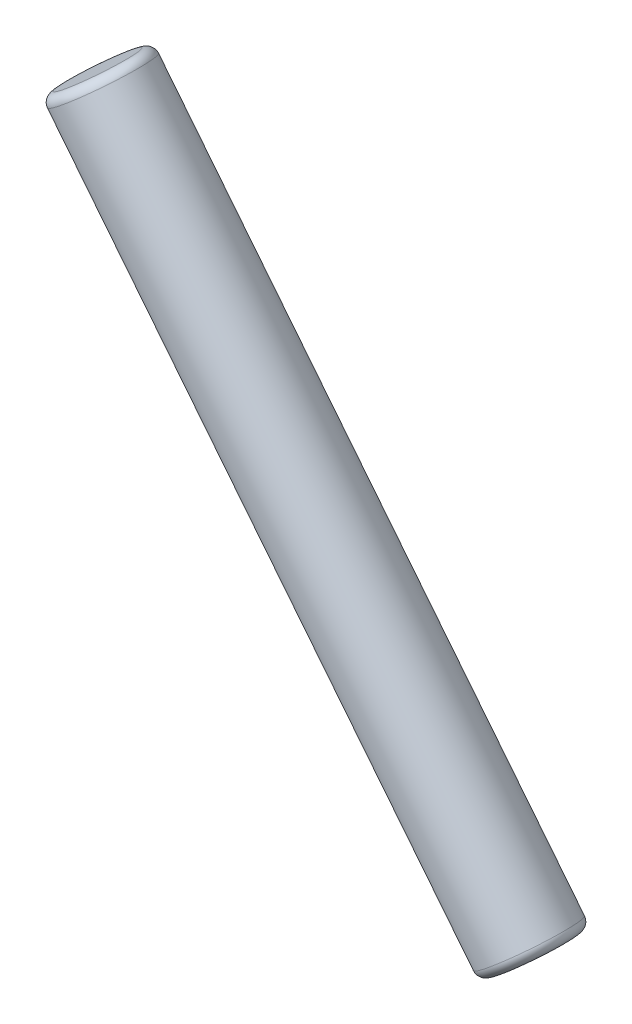
ISO-10303-21;
HEADER;
FILE_DESCRIPTION(('STEP AP214'),'2;1');
FILE_NAME('part.step','',(''),(''),'','','');
FILE_SCHEMA(('AUTOMOTIVE_DESIGN { 1 0 10303 214 1 1 1 1 }'));
ENDSEC;
DATA;
#1=APPLICATION_CONTEXT('core data for automotive mechanical design processes');
#2=APPLICATION_PROTOCOL_DEFINITION('international standard','automotive_design',2000,#1);
#3=PRODUCT_CONTEXT('',#1,'mechanical');
#4=PRODUCT('Part','Part','',(#3));
#5=PRODUCT_RELATED_PRODUCT_CATEGORY('part','',(#4));
#6=PRODUCT_DEFINITION_FORMATION('','',#4);
#7=PRODUCT_DEFINITION_CONTEXT('part definition',#1,'design');
#8=PRODUCT_DEFINITION('design','',#6,#7);
#9=PRODUCT_DEFINITION_SHAPE('','',#8);
#10=(LENGTH_UNIT() NAMED_UNIT(*) SI_UNIT(.MILLI.,.METRE.));
#11=(NAMED_UNIT(*) PLANE_ANGLE_UNIT() SI_UNIT($,.RADIAN.));
#12=(NAMED_UNIT(*) SI_UNIT($,.STERADIAN.) SOLID_ANGLE_UNIT());
#13=UNCERTAINTY_MEASURE_WITH_UNIT(LENGTH_MEASURE(1.E-05),#10,'distance_accuracy_value','');
#14=(GEOMETRIC_REPRESENTATION_CONTEXT(3) GLOBAL_UNCERTAINTY_ASSIGNED_CONTEXT((#13)) GLOBAL_UNIT_ASSIGNED_CONTEXT((#10,
#11,#12)) REPRESENTATION_CONTEXT('',''));
#15=CARTESIAN_POINT('',(0.,0.,0.));
#16=DIRECTION('',(0.,0.,1.));
#17=DIRECTION('',(1.,0.,0.));
#18=AXIS2_PLACEMENT_3D('',#15,#16,#17);
#19=CARTESIAN_POINT('',(12.5290575606454,22.7820700692899,0.));
#20=DIRECTION('',(0.623489801858733,-0.78183148246803,0.));
#21=DIRECTION('',(0.78183148246803,0.623489801858733,0.));
#22=AXIS2_PLACEMENT_3D('',#19,#20,#21);
#23=PLANE('',#22);
#24=CARTESIAN_POINT('',(13.2877205426222,23.3870836085466,0.241638360145948));
#25=CARTESIAN_POINT('',(13.2856597915392,23.3854402143968,0.252223433963998));
#26=CARTESIAN_POINT('',(13.2834635276493,23.3836887523896,0.262765342193873));
#27=CARTESIAN_POINT('',(13.2788025527824,23.379971748967,0.283751621311412));
#28=CARTESIAN_POINT('',(13.2763378418055,23.3780062075517,0.294195992199074));
#29=CARTESIAN_POINT('',(13.2711425512915,23.3738631016192,0.31497599046632));
#30=CARTESIAN_POINT('',(13.2684119717544,23.3716855371022,0.325311617845904));
#31=CARTESIAN_POINT('',(13.2626878843703,23.3671207297377,0.345863067362468));
#32=CARTESIAN_POINT('',(13.2596943765232,23.3647334868903,0.356078889499448));
#33=CARTESIAN_POINT('',(13.2534476336809,23.3597518757063,0.376379787587888));
#34=CARTESIAN_POINT('',(13.2501943986856,23.3571575073698,0.386464863539348));
#35=CARTESIAN_POINT('',(13.2434316863609,23.3517644242541,0.406493470329436));
#36=CARTESIAN_POINT('',(13.2399222090315,23.3489657094751,0.416437001168062));
#37=CARTESIAN_POINT('',(13.2326507697617,23.3431669301585,0.436171869836825));
#38=CARTESIAN_POINT('',(13.2288888078213,23.3401668656211,0.44596320766696));
#39=CARTESIAN_POINT('',(13.2211164278164,23.3339685993989,0.465383205539433));
#40=CARTESIAN_POINT('',(13.217106009752,23.3307703977143,0.47501186558177));
#41=CARTESIAN_POINT('',(13.2088410119328,23.3241792818942,0.494096197260131));
#42=CARTESIAN_POINT('',(13.204586432178,23.3207863677589,0.503551868896155));
#43=CARTESIAN_POINT('',(13.1958376668945,23.3138094602598,0.522280098394052));
#44=CARTESIAN_POINT('',(13.1913434813659,23.310225466896,0.531552656255925));
#45=CARTESIAN_POINT('',(13.1821203170197,23.3028702387686,0.549904728917723));
#46=CARTESIAN_POINT('',(13.1773913382021,23.299099004005,0.558984243717649));
#47=CARTESIAN_POINT('',(13.1677036511873,23.2913733314109,0.576940507683845));
#48=CARTESIAN_POINT('',(13.1627449429901,23.2874188935804,0.585817256850114));
#49=CARTESIAN_POINT('',(13.152603107125,23.2793310493635,0.603358484103611));
#50=CARTESIAN_POINT('',(13.147419979457,23.2751976429771,0.612022962190837));
#51=CARTESIAN_POINT('',(13.1368348548733,23.2667562878036,0.629130369146101));
#52=CARTESIAN_POINT('',(13.1314328579576,23.2624483390165,0.637573298014139));
#53=CARTESIAN_POINT('',(13.1204157794719,23.2536625121009,0.654228565631318));
#54=CARTESIAN_POINT('',(13.1148006979019,23.2491846339725,0.662440904380459));
#55=CARTESIAN_POINT('',(13.1033634628778,23.2400637433983,0.678626197781816));
#56=CARTESIAN_POINT('',(13.0975413094236,23.2354207309526,0.686599152434031));
#57=CARTESIAN_POINT('',(13.0856961651388,23.225974543598,0.702297140001996));
#58=CARTESIAN_POINT('',(13.0796731743081,23.2211713686891,0.710022172917745));
#59=CARTESIAN_POINT('',(13.0674328048398,23.211409999768,0.725216044854038));
#60=CARTESIAN_POINT('',(13.0612154262021,23.2064518057559,0.732684883874582));
#61=CARTESIAN_POINT('',(13.0485929388445,23.1963857079867,0.747358370200569));
#62=CARTESIAN_POINT('',(13.0421878301246,23.1912778042296,0.754563017506011));
#63=CARTESIAN_POINT('',(13.0291967413533,23.1809177566419,0.768700405485002));
#64=CARTESIAN_POINT('',(13.022610761302,23.1756656128113,0.775633146158552));
#65=CARTESIAN_POINT('',(13.0092649823003,23.1650227092035,0.789219297121397));
#66=CARTESIAN_POINT('',(13.00250518335,23.1596319494264,0.795872707410694));
#67=CARTESIAN_POINT('',(12.9888190051123,23.1487175864864,0.808893072966647));
#68=CARTESIAN_POINT('',(12.981892625825,23.1431939833235,0.815260028233304));
#69=CARTESIAN_POINT('',(12.9678807038538,23.1320198484243,0.827700665848802));
#70=CARTESIAN_POINT('',(12.9607951611699,23.1263693166882,0.833774348197644));
#71=CARTESIAN_POINT('',(12.9464724997822,23.1149473753735,0.845621936126325));
#72=CARTESIAN_POINT('',(12.9392353810784,23.109175965795,0.851395841706164));
#73=CARTESIAN_POINT('',(12.9246173173387,23.0975184489656,0.862637693254124));
#74=CARTESIAN_POINT('',(12.9172363723029,23.0916323417147,0.868105639222245));
#75=CARTESIAN_POINT('',(12.9023385596,23.0797517325317,0.878729716333269));
#76=CARTESIAN_POINT('',(12.894821691933,23.0737572305995,0.883885847476171));
#77=CARTESIAN_POINT('',(12.879660083218,23.0616662511166,0.893880773622384));
#78=CARTESIAN_POINT('',(12.87201534217,23.0555697735659,0.898719568625694));
#79=CARTESIAN_POINT('',(12.8566061728732,23.0432813711069,0.908074640989833));
#80=CARTESIAN_POINT('',(12.8488417446244,23.0370894461986,0.912590918350662));
#81=CARTESIAN_POINT('',(12.8332015152702,23.0246167794926,0.92129611928692));
#82=CARTESIAN_POINT('',(12.8253257141648,23.018336037695,0.92548504286235));
#83=CARTESIAN_POINT('',(12.8094711727026,23.0056924627859,0.933531050623523));
#84=CARTESIAN_POINT('',(12.8014924323457,22.9993296296745,0.937388134809268));
#85=CARTESIAN_POINT('',(12.7854405562156,22.9865286856191,0.944766333528716));
#86=CARTESIAN_POINT('',(12.7773674204423,22.9800905746751,0.94828744806242));
#87=CARTESIAN_POINT('',(12.7611353983953,22.9671459690448,0.95498993698015));
#88=CARTESIAN_POINT('',(12.7529765121215,22.9606394743586,0.958171311364176));
#89=CARTESIAN_POINT('',(12.7365817258134,22.9475650685614,0.964190913287176));
#90=CARTESIAN_POINT('',(12.728345825779,22.9409971574505,0.967029140826149));
#91=CARTESIAN_POINT('',(12.7118058311575,22.9278069518876,0.972359409813905));
#92=CARTESIAN_POINT('',(12.7035017365704,22.9211846574357,0.974851451262687));
#93=CARTESIAN_POINT('',(12.6868342450762,22.9078927765096,0.979486679529658));
#94=CARTESIAN_POINT('',(12.678470848169,22.9012231900354,0.981629866347847));
#95=CARTESIAN_POINT('',(12.6616937077694,22.8878438670252,0.985565090375505));
#96=CARTESIAN_POINT('',(12.6532799642769,22.881134130489,0.987357127584975));
#97=CARTESIAN_POINT('',(12.636411140354,22.8676816923088,0.990588133436863));
#98=CARTESIAN_POINT('',(12.6279560599235,22.8609389906646,0.992027102079281));
#99=CARTESIAN_POINT('',(12.6110136160366,22.8474278425221,0.994550429913414));
#100=CARTESIAN_POINT('',(12.60252625258,22.8406593960238,0.995634789105128));
#101=CARTESIAN_POINT('',(12.5855283311222,22.8271040059948,0.997447736878826));
#102=CARTESIAN_POINT('',(12.5770177731209,22.8203170624642,0.998176325460809));
#103=CARTESIAN_POINT('',(12.5599825758926,22.8067319460003,0.999276951824305));
#104=CARTESIAN_POINT('',(12.5514579366656,22.799933773067,0.999648989605818));
#105=CARTESIAN_POINT('',(12.5344037053813,22.7863334774499,1.00003611598039));
#106=CARTESIAN_POINT('',(12.5258741133241,22.7795313547663,1.00005120457345));
#107=CARTESIAN_POINT('',(12.5088191100869,22.7659304435373,0.99972441641614));
#108=CARTESIAN_POINT('',(12.5002936989069,22.7591316549919,0.999382539665765));
#109=CARTESIAN_POINT('',(12.4832561866231,22.7455446923329,0.99834218690334));
#110=CARTESIAN_POINT('',(12.4747440855194,22.7387565182192,0.99764371089129));
#111=CARTESIAN_POINT('',(12.4577423084517,22.725198053444,0.995890907582567));
#112=CARTESIAN_POINT('',(12.4492526324877,22.7184277627825,0.994836580285895));
#113=CARTESIAN_POINT('',(12.4323047963123,22.7049123144335,0.992373203290655));
#114=CARTESIAN_POINT('',(12.423846636101,22.698167156746,0.990964153592089));
#115=CARTESIAN_POINT('',(12.4069708899274,22.6847091982551,0.987792841076723));
#116=CARTESIAN_POINT('',(12.3985533039652,22.6779963974516,0.986030578259924));
#117=CARTESIAN_POINT('',(12.3817677152498,22.6646103371343,0.982154724948801));
#118=CARTESIAN_POINT('',(12.3733997124965,22.6579370776205,0.980041134454478));
#119=CARTESIAN_POINT('',(12.3567222687874,22.6446372600679,0.975464895173818));
#120=CARTESIAN_POINT('',(12.3484128278316,22.6380107020291,0.97300224638748));
#121=CARTESIAN_POINT('',(12.3315426787038,22.6245572070332,0.967629009808859));
#122=CARTESIAN_POINT('',(12.3229846154754,22.6177323793482,0.964704825255078));
#123=CARTESIAN_POINT('',(12.3060615335643,22.6042366718662,0.958526525994705));
#124=CARTESIAN_POINT('',(12.2976954505029,22.5975649432556,0.955277179075327));
#125=CARTESIAN_POINT('',(12.2811624708409,22.5843803319362,0.94846645495861));
#126=CARTESIAN_POINT('',(12.2729944012516,22.5778665138002,0.944909735723109));
#127=CARTESIAN_POINT('',(12.2568628337162,22.5650020179698,0.937502085681455));
#128=CARTESIAN_POINT('',(12.2488980599047,22.5586503228066,0.933655699706846));
#129=CARTESIAN_POINT('',(12.2331777019587,22.546113755681,0.925686397267516));
#130=CARTESIAN_POINT('',(12.2254207452652,22.5399277891392,0.921567909782253));
#131=CARTESIAN_POINT('',(12.2101199130499,22.5277257826197,0.913071911584717));
#132=CARTESIAN_POINT('',(12.2025745742417,22.52170857571,0.908698711623935));
#133=CARTESIAN_POINT('',(12.1877001598413,22.5098466260504,0.89971057416571));
#134=CARTESIAN_POINT('',(12.1803695362954,22.5040006488486,0.895099827346084));
#135=CARTESIAN_POINT('',(12.1659270894151,22.4924831817912,0.885653657436953));
#136=CARTESIAN_POINT('',(12.1588136389556,22.4868103943466,0.880822303042184));
#137=CARTESIAN_POINT('',(12.1448073350677,22.4756407397193,0.870951605813886));
#138=CARTESIAN_POINT('',(12.1379127825079,22.4701425175245,0.865916209797978));
#139=CARTESIAN_POINT('',(12.1243458175753,22.4593232240227,0.85565414213055));
#140=CARTESIAN_POINT('',(12.1176716346088,22.4540007407143,0.850431289769975));
#141=CARTESIAN_POINT('',(12.0981287020363,22.4384157720467,0.834617435852122));
#142=CARTESIAN_POINT('',(12.0854361948773,22.4282938353489,0.823666761953106));
#143=CARTESIAN_POINT('',(12.0609494045279,22.4087662716654,0.801174991970102));
#144=CARTESIAN_POINT('',(12.0491395975355,22.3993482648606,0.789661467257256));
#145=CARTESIAN_POINT('',(12.0264084793505,22.3812208030074,0.766162284427632));
#146=CARTESIAN_POINT('',(12.0154709848173,22.3724984421753,0.754202245432572));
#147=CARTESIAN_POINT('',(11.9944692387188,22.3557501085399,0.729922581534168));
#148=CARTESIAN_POINT('',(11.9843882574326,22.3477107942294,0.717626619698502));
#149=CARTESIAN_POINT('',(11.9650778342312,22.3323112455956,0.692780216737492));
#150=CARTESIAN_POINT('',(11.9558312748436,22.3249373605438,0.680251534365731));
#151=CARTESIAN_POINT('',(11.9381628935008,22.3108472965949,0.655037519219607));
#152=CARTESIAN_POINT('',(11.9297237004848,22.304117264739,0.642372094129097));
#153=CARTESIAN_POINT('',(11.9136388661696,22.2912900374035,0.616974980696745));
#154=CARTESIAN_POINT('',(11.9059757281132,22.2851788887255,0.60426141553186));
#155=CARTESIAN_POINT('',(11.8914082501207,22.2735617126774,0.578851018111671));
#156=CARTESIAN_POINT('',(11.8844864044957,22.2680417249862,0.566170598986471));
#157=CARTESIAN_POINT('',(11.8713639136059,22.2575768876981,0.540902208383816));
#158=CARTESIAN_POINT('',(11.8651458607434,22.2526181560053,0.528329021612275));
#159=CARTESIAN_POINT('',(11.8533911913254,22.2432441199399,0.503343720209403));
#160=CARTESIAN_POINT('',(11.8478373624303,22.2388150891844,0.490944848836514));
#161=CARTESIAN_POINT('',(11.8373698294881,22.230467510204,0.466369964309293));
#162=CARTESIAN_POINT('',(11.8324391960669,22.2265354612539,0.454205743903261));
#163=CARTESIAN_POINT('',(11.8231757579967,22.2191481158892,0.430155409696986));
#164=CARTESIAN_POINT('',(11.8188263855639,22.215679607108,0.418279731785099));
#165=CARTESIAN_POINT('',(11.8106826969388,22.2091852321251,0.394855540457255));
#166=CARTESIAN_POINT('',(11.8068722445058,22.206146497701,0.383316200957973));
#167=CARTESIAN_POINT('',(11.7997635978534,22.2004775411445,0.360607907063389));
#168=CARTESIAN_POINT('',(11.7964497608652,22.1978348443205,0.349446960746459));
#169=CARTESIAN_POINT('',(11.7902919331558,22.1929241405651,0.327533294548145));
#170=CARTESIAN_POINT('',(11.7874328470056,22.190644095431,0.316787509434604));
#171=CARTESIAN_POINT('',(11.7821428159267,22.1864254363916,0.295736809153008));
#172=CARTESIAN_POINT('',(11.7796973713254,22.1844752593833,0.285437857742093));
#173=CARTESIAN_POINT('',(11.7751940455505,22.1808839768842,0.265309460657609));
#174=CARTESIAN_POINT('',(11.7731222965057,22.1792318121355,0.255485067420064));
#175=CARTESIAN_POINT('',(11.7675985981514,22.174826809636,0.227605524034654));
#176=CARTESIAN_POINT('',(11.7644214123099,22.1722930884349,0.209459825363372));
#177=CARTESIAN_POINT('',(11.759214055992,22.1681403602494,0.175277841806806));
#178=CARTESIAN_POINT('',(11.7570896698704,22.1664462187975,0.159264801748661));
#179=CARTESIAN_POINT('',(11.7537159007495,22.1637557275812,0.129450595424793));
#180=CARTESIAN_POINT('',(11.7523843902674,22.1626938833384,0.115664608068123));
#181=CARTESIAN_POINT('',(11.7503584942727,22.1610782850436,0.0903711419379079));
#182=CARTESIAN_POINT('',(11.7495944325519,22.1604689660746,0.078872736816823));
#183=CARTESIAN_POINT('',(11.7485014404705,22.1595973337845,0.058193442212776));
#184=CARTESIAN_POINT('',(11.7481155867833,22.159289625635,0.0490174105437679));
#185=CARTESIAN_POINT('',(11.747547269549,22.1588364075201,0.0308343788235137));
#186=CARTESIAN_POINT('',(11.7473609803737,22.1586878467187,0.0218275781099897));
#187=CARTESIAN_POINT('',(11.7472252819043,22.158579630374,0.00854657530328007));
#188=CARTESIAN_POINT('',(11.7472028298053,22.158561725252,0.00427334126555329));
#189=CARTESIAN_POINT('',(11.7471973016591,22.1585573154571,-0.00914833665662582));
#190=CARTESIAN_POINT('',(11.7472883648416,22.1586299340367,-0.0182971647375058));
#191=CARTESIAN_POINT('',(11.747575455028,22.1588588784211,-0.032014982392404));
#192=CARTESIAN_POINT('',(11.7476962379582,22.1589551988653,-0.0365867688657817));
#193=CARTESIAN_POINT('',(11.7479870393935,22.1591871038474,-0.0457277681372508));
#194=CARTESIAN_POINT('',(11.7481570582322,22.1593226886515,-0.0502969809176935));
#195=CARTESIAN_POINT('',(11.749022895062,22.1600131676822,-0.0706051369605453));
#196=CARTESIAN_POINT('',(11.7499875808051,22.1607824775,-0.0863269813354057));
#197=CARTESIAN_POINT('',(11.7525014236517,22.1627871999282,-0.117693075893428));
#198=CARTESIAN_POINT('',(11.7540505810443,22.1640226127694,-0.133337326038201));
#199=CARTESIAN_POINT('',(11.7577300235937,22.1669568742189,-0.164513591008629));
#200=CARTESIAN_POINT('',(11.7598602987419,22.1686557148456,-0.180045607762538));
#201=CARTESIAN_POINT('',(11.7646967802042,22.1725126850414,-0.210961677885279));
#202=CARTESIAN_POINT('',(11.7674029663933,22.1746707985612,-0.226345736404821));
#203=CARTESIAN_POINT('',(11.7703945786685,22.1770565300332,-0.241638360145922));
#204=B_SPLINE_CURVE_WITH_KNOTS('',3,(#24,#25,#26,#27,#28,#29,#30,#31,#32,#33,#34,#35,#36,#37,
#38,#39,#40,#41,#42,#43,#44,#45,#46,#47,#48,#49,#50,#51,#52,#53,#54,#55,#56,#57,#58,#59,#60,#61,
#62,#63,#64,#65,#66,#67,#68,#69,#70,#71,#72,#73,#74,#75,#76,#77,#78,#79,#80,#81,#82,#83,#84,#85,
#86,#87,#88,#89,#90,#91,#92,#93,#94,#95,#96,#97,#98,#99,#100,#101,#102,#103,#104,#105,#106,#107,
#108,#109,#110,#111,#112,#113,#114,#115,#116,#117,#118,#119,#120,#121,#122,#123,#124,#125,#126,
#127,#128,#129,#130,#131,#132,#133,#134,#135,#136,#137,#138,#139,#140,#141,#142,#143,#144,#145,
#146,#147,#148,#149,#150,#151,#152,#153,#154,#155,#156,#157,#158,#159,#160,#161,#162,#163,#164,
#165,#166,#167,#168,#169,#170,#171,#172,#173,#174,#175,#176,#177,#178,#179,#180,#181,#182,#183,
#184,#185,#186,#187,#188,#189,#190,#191,#192,#193,#194,#195,#196,#197,#198,#199,#200,#201,#202,
#203),.UNSPECIFIED.,.F.,.F.,(4,2,2,2,2,2,2,2,2,2,2,2,2,2,2,2,2,2,2,2,2,2,2,2,2,2,2,2,2,2,2,2,2,
2,2,2,2,2,2,2,2,2,2,2,2,2,2,2,2,2,2,2,2,2,2,2,2,2,2,2,2,2,2,2,2,2,2,2,2,2,2,2,2,2,2,2,2,2,2,2,2,
2,2,2,2,2,2,2,2,4),(0.,0.0327234632529736,0.0654469265059474,0.0981703897589205,
0.130893853011894,0.163617316264867,0.196340779517841,0.229064242770815,0.261787706023789,
0.294511169276761,0.327234632529735,0.359958095782708,0.392681559035682,0.425405022288656,
0.458128485541629,0.490851948794603,0.523575412047577,0.55629887530055,0.589022338553524,
0.621745801806496,0.65446926505947,0.687192728312444,0.719916191565416,0.752639654818391,
0.785363118071365,0.818086581324336,0.850810044577312,0.883533507830284,0.916256971083258,
0.94898043433623,0.981703897589205,1.01442736084218,1.04715082409515,1.07987428734813,
1.1125977506011,1.14532121385407,1.17804467710705,1.21076814036002,1.24349160361299,
1.27621506686597,1.30893853011894,1.34166199337191,1.37438545662489,1.40710891987786,
1.43983238313083,1.47255584638381,1.50527930963678,1.53800277288975,1.57072623614273,
1.60470972640987,1.6382527285177,1.67135524120169,1.70401726320378,1.73623879327242,
1.76801983016251,1.79936037263547,1.83026041945919,1.86071996940803,1.89073902126286,
1.94944930000992,2.00639812454318,2.06158545218535,2.11501124138851,2.16667545173411,
2.216578043933,2.26471897982548,2.31109822238128,2.35571573569961,2.39857148500917,
2.43966543666821,2.47899755816448,2.51656781811534,2.55237618626771,2.58642263349813,
2.61870713181278,2.64922965434751,2.70498325963034,2.75369047271834,2.79535066562637,
2.82996329409336,2.85752789759244,2.88455407780285,2.89737390001284,2.92481847842761,
2.93854127621855,2.95226416699313,2.99955452894123,3.04684491428347,3.09413448519998,
3.14142240387355),.UNSPECIFIED.);
#205=CARTESIAN_POINT('',(13.2877205426222,23.3870836085466,0.241638360145949));
#206=VERTEX_POINT('',#205);
#207=CARTESIAN_POINT('',(11.7703945786685,22.1770565300332,-0.241638360145923));
#208=VERTEX_POINT('',#207);
#209=EDGE_CURVE('E44',#206,#208,#204,.T.);
#210=ORIENTED_EDGE('',*,*,#209,.F.);
#211=CARTESIAN_POINT('',(12.5290575606454,22.7820700692899,0.));
#212=DIRECTION('',(-0.623489801858732,0.781831482468031,0.));
#213=DIRECTION('',(-0.781831482468031,-0.623489801858732,0.));
#214=AXIS2_PLACEMENT_3D('',#211,#212,#213);
#215=CIRCLE('',#214,1.);
#216=EDGE_CURVE('E22',#208,#206,#215,.F.);
#217=ORIENTED_EDGE('',*,*,#216,.F.);
#218=EDGE_LOOP('',(#210,#217));
#219=FACE_BOUND('',#218,.T.);
#220=ADVANCED_FACE('F17',(#219),#23,.F.);
#221=CARTESIAN_POINT('',(24.99885359782,7.1454404199293,0.));
#222=DIRECTION('',(0.623489801858733,-0.78183148246803,0.));
#223=DIRECTION('',(0.78183148246803,0.623489801858733,0.));
#224=AXIS2_PLACEMENT_3D('',#221,#222,#223);
#225=PLANE('',#224);
#226=CARTESIAN_POINT('',(25.7575165797969,7.75045395918601,0.241638360145922));
#227=CARTESIAN_POINT('',(25.7594377357927,7.75198602996948,0.231770796614636));
#228=CARTESIAN_POINT('',(25.7612412642348,7.75342429590722,0.221865771074119));
#229=CARTESIAN_POINT('',(25.7646115664444,7.75611202223312,0.20199003218028));
#230=CARTESIAN_POINT('',(25.7661783399914,7.75736148244531,0.192019318765744));
#231=CARTESIAN_POINT('',(25.7690736320552,7.75967040083298,0.172021439432066));
#232=CARTESIAN_POINT('',(25.7704021501115,7.76072985864124,0.161994273403853));
#233=CARTESIAN_POINT('',(25.7728197108763,7.76265779906316,0.141892795292575));
#234=CARTESIAN_POINT('',(25.7739087528822,7.7635262811166,0.131818483071295));
#235=CARTESIAN_POINT('',(25.775846344898,7.76507145929668,0.111632048225456));
#236=CARTESIAN_POINT('',(25.7766948939618,7.76574815466881,0.101519925452301));
#237=CARTESIAN_POINT('',(25.7781507184322,7.76690913615634,0.0812672792124617));
#238=CARTESIAN_POINT('',(25.7787579926482,7.76739342132221,0.0711267556058704));
#239=CARTESIAN_POINT('',(25.7797306774595,7.76816911194138,0.0508266022070877));
#240=CARTESIAN_POINT('',(25.7800960866192,7.76846051624981,0.0406669723018487));
#241=CARTESIAN_POINT('',(25.7805847892732,7.76885024420243,0.02033844583348));
#242=CARTESIAN_POINT('',(25.7807080810881,7.76894856650738,0.010169549206564));
#243=CARTESIAN_POINT('',(25.7807138932437,7.76895320277495,-0.0192708391216995));
#244=CARTESIAN_POINT('',(25.7802821840089,7.76860892717056,-0.0385440215622093));
#245=CARTESIAN_POINT('',(25.7785485455634,7.76722639897664,-0.0770253576584081));
#246=CARTESIAN_POINT('',(25.7772466037171,7.76618813631055,-0.096233510365807));
#247=CARTESIAN_POINT('',(25.7737769983705,7.76342122126629,-0.134522055943207));
#248=CARTESIAN_POINT('',(25.7716093228457,7.76169255929895,-0.153602447034942));
#249=CARTESIAN_POINT('',(25.7664154271345,7.75755056906155,-0.19157127389266));
#250=CARTESIAN_POINT('',(25.7633891955645,7.75513723171345,-0.210459707110054));
#251=CARTESIAN_POINT('',(25.7564882981262,7.74963395342042,-0.247981561799112));
#252=CARTESIAN_POINT('',(25.7526136215432,7.74654400393089,-0.266614980047158));
#253=CARTESIAN_POINT('',(25.7440287532521,7.73969780401163,-0.303564494384476));
#254=CARTESIAN_POINT('',(25.7393185515193,7.73594154558741,-0.321880586663519));
#255=CARTESIAN_POINT('',(25.7290784023597,7.72777530346303,-0.358134120680436));
#256=CARTESIAN_POINT('',(25.7235484456141,7.72336531233132,-0.376071558111151));
#257=CARTESIAN_POINT('',(25.7116871058217,7.71390621398441,-0.411508135345812));
#258=CARTESIAN_POINT('',(25.7053557141694,7.70885709990654,-0.429007270441));
#259=CARTESIAN_POINT('',(25.6927366347641,7.69879372419753,-0.461394172991207));
#260=CARTESIAN_POINT('',(25.6865386036451,7.69385096134253,-0.476339236679908));
#261=CARTESIAN_POINT('',(25.6735577785489,7.68349910281687,-0.505808402081578));
#262=CARTESIAN_POINT('',(25.666774979669,7.67809000323656,-0.520332500263921));
#263=CARTESIAN_POINT('',(25.6526421608837,7.66681946038482,-0.548922061237854));
#264=CARTESIAN_POINT('',(25.6452921364979,7.66095801354049,-0.562987520405606));
#265=CARTESIAN_POINT('',(25.6300437556058,7.64879783954076,-0.590623659684929));
#266=CARTESIAN_POINT('',(25.6221453950343,7.64249910914359,-0.604194336127333));
#267=CARTESIAN_POINT('',(25.6058206737032,7.62948058219539,-0.630805946400438));
#268=CARTESIAN_POINT('',(25.5973943092854,7.62276078272706,-0.643846876559874));
#269=CARTESIAN_POINT('',(25.5800352641154,7.60891740991648,-0.66936541956325));
#270=CARTESIAN_POINT('',(25.571102580101,7.60179383397262,-0.681843028776682));
#271=CARTESIAN_POINT('',(25.5527538860494,7.58716124235713,-0.706202798765281));
#272=CARTESIAN_POINT('',(25.5433378731325,7.57965222438899,-0.71808495599186));
#273=CARTESIAN_POINT('',(25.5240467560488,7.56426807529733,-0.741223225784136));
#274=CARTESIAN_POINT('',(25.5141716493695,7.55639294217005,-0.752479334922728));
#275=CARTESIAN_POINT('',(25.493987762319,7.54029683257322,-0.774336523779878));
#276=CARTESIAN_POINT('',(25.4836789797847,7.5320758543786,-0.78493760023052));
#277=CARTESIAN_POINT('',(25.4626542756963,7.51530921533002,-0.805457425721193));
#278=CARTESIAN_POINT('',(25.4519383523089,7.50676355301405,-0.8153761716882));
#279=CARTESIAN_POINT('',(25.4301269500023,7.48936954281002,-0.834505795172684));
#280=CARTESIAN_POINT('',(25.4190314695582,7.48052119370582,-0.843716669845557));
#281=CARTESIAN_POINT('',(25.3964895143736,7.46254458674102,-0.861406832517857));
#282=CARTESIAN_POINT('',(25.3850430383932,7.45341632789155,-0.869886117932305));
#283=CARTESIAN_POINT('',(25.3618285575464,7.43490339930888,-0.886091267789109));
#284=CARTESIAN_POINT('',(25.3500605517002,7.42551872879417,-0.893817129934853));
#285=CARTESIAN_POINT('',(25.3262333048002,7.40651713527637,-0.908495539151069));
#286=CARTESIAN_POINT('',(25.3141740630001,7.39690021167805,-0.915448084239443));
#287=CARTESIAN_POINT('',(25.2897953880971,7.37745886867507,-0.9285619566993));
#288=CARTESIAN_POINT('',(25.2774759544536,7.36763444883928,-0.934723282426625));
#289=CARTESIAN_POINT('',(25.2526086100187,7.34780340455151,-0.946238851119174));
#290=CARTESIAN_POINT('',(25.2400606988634,7.33779677980932,-0.951593092798785));
#291=CARTESIAN_POINT('',(25.214768702107,7.31762708625049,-0.961480706830353));
#292=CARTESIAN_POINT('',(25.2020246162885,7.30746401726056,-0.966014078272931));
#293=CARTESIAN_POINT('',(25.1763730782333,7.28700759873319,-0.974248279271153));
#294=CARTESIAN_POINT('',(25.1634656258949,7.27671424911463,-0.977949108308336));
#295=CARTESIAN_POINT('',(25.1375205836301,7.2560237684369,-0.984508696020997));
#296=CARTESIAN_POINT('',(25.1244829936858,7.24562663736344,-0.987367454580548));
#297=CARTESIAN_POINT('',(25.0983112402337,7.22475536019243,-0.992235541500013));
#298=CARTESIAN_POINT('',(25.0851770767594,7.21428121412164,-0.994244870155023));
#299=CARTESIAN_POINT('',(25.0588459889936,7.19328287172286,-0.997408925027428));
#300=CARTESIAN_POINT('',(25.0456490647543,7.18275867543653,-0.998563651956257));
#301=CARTESIAN_POINT('',(25.0192264298135,7.16168732625333,-1.00001553206326));
#302=CARTESIAN_POINT('',(25.0060007191499,7.15114017338673,-1.00031268637133));
#303=CARTESIAN_POINT('',(24.9795545597944,7.13005006376679,-1.00004865850124));
#304=CARTESIAN_POINT('',(24.966334111093,7.11950710700593,-0.999487477870325));
#305=CARTESIAN_POINT('',(24.9399325104541,7.09845253144364,-0.997508227924455));
#306=CARTESIAN_POINT('',(24.9267513584267,7.08794091257059,-0.996090160569804));
#307=CARTESIAN_POINT('',(24.9004622846013,7.06697607382587,-0.99240079177949));
#308=CARTESIAN_POINT('',(24.8873543626003,7.05652285379237,-0.990129492709672));
#309=CARTESIAN_POINT('',(24.8612454935424,7.03570172324643,-0.984739512468404));
#310=CARTESIAN_POINT('',(24.8482445461372,7.02533381245618,-0.981620834057638));
#311=CARTESIAN_POINT('',(24.8223830952987,7.00470999106434,-0.974544129402423));
#312=CARTESIAN_POINT('',(24.8095225913399,6.99445408004368,-0.970586106299661));
#313=CARTESIAN_POINT('',(24.7839751345088,6.97408066024376,-0.96184090810486));
#314=CARTESIAN_POINT('',(24.7712881809029,6.96396315087951,-0.957053736518591));
#315=CARTESIAN_POINT('',(24.7461204846864,6.94389257981175,-0.946662572494628));
#316=CARTESIAN_POINT('',(24.7336397411042,6.9339395173334,-0.941058583906843));
#317=CARTESIAN_POINT('',(24.7089165934993,6.91422346172462,-0.929048220525042));
#318=CARTESIAN_POINT('',(24.6966741882379,6.90446046760643,-0.92264184990219));
#319=CARTESIAN_POINT('',(24.6724592317246,6.88514968066675,-0.909043223395576));
#320=CARTESIAN_POINT('',(24.6604866789394,6.87560188662251,-0.901850971978501));
#321=CARTESIAN_POINT('',(24.636842246529,6.8567460772978,-0.886699108596559));
#322=CARTESIAN_POINT('',(24.6251703650495,6.84743806053861,-0.878739501365427));
#323=CARTESIAN_POINT('',(24.6021573197084,6.82908576545569,-0.862073427088541));
#324=CARTESIAN_POINT('',(24.5908161536469,6.82004148537756,-0.853366965012466));
#325=CARTESIAN_POINT('',(24.5684937315123,6.80223994381244,-0.835229604958927));
#326=CARTESIAN_POINT('',(24.5575124728704,6.79348268027696,-0.825798712153486));
#327=CARTESIAN_POINT('',(24.5359381306596,6.77627771246821,-0.806236779938555));
#328=CARTESIAN_POINT('',(24.5253450441319,6.76783000583541,-0.796105745867476));
#329=CARTESIAN_POINT('',(24.5045743111406,6.75126589495656,-0.775169623199924));
#330=CARTESIAN_POINT('',(24.4943966613089,6.74314948802451,-0.764364540070081));
#331=CARTESIAN_POINT('',(24.4744829963792,6.72726886611973,-0.742108146896639));
#332=CARTESIAN_POINT('',(24.4647469774865,6.71950464812077,-0.730656842407676));
#333=CARTESIAN_POINT('',(24.445741631312,6.70434838629712,-0.707137497940839));
#334=CARTESIAN_POINT('',(24.4364722997939,6.69695633909393,-0.695069463563521));
#335=CARTESIAN_POINT('',(24.4184241829225,6.68256344225674,-0.670347738549326));
#336=CARTESIAN_POINT('',(24.4096453928781,6.67556258888177,-0.657694053515143));
#337=CARTESIAN_POINT('',(24.3926009497336,6.66197009527068,-0.631833614128787));
#338=CARTESIAN_POINT('',(24.3843352914774,6.65537845092275,-0.618626865336156));
#339=CARTESIAN_POINT('',(24.3683383807918,6.64262133675936,-0.591694309082603));
#340=CARTESIAN_POINT('',(24.3606071227334,6.63645586245486,-0.577968507091469));
#341=CARTESIAN_POINT('',(24.3456989044527,6.62456695175305,-0.550033191229381));
#342=CARTESIAN_POINT('',(24.3385219381228,6.61884351048508,-0.535823682690753));
#343=CARTESIAN_POINT('',(24.3247407679896,6.60785339098358,-0.506957545267365));
#344=CARTESIAN_POINT('',(24.3181365575973,6.60258670749548,-0.492300921528864));
#345=CARTESIAN_POINT('',(24.3055178862786,6.59252365021507,-0.462578296811849));
#346=CARTESIAN_POINT('',(24.2995034182817,6.58772727078412,-0.447512300744224));
#347=CARTESIAN_POINT('',(24.2880797080048,6.57861716354673,-0.417009724583622));
#348=CARTESIAN_POINT('',(24.282670458175,6.57430342971942,-0.401573149116448));
#349=CARTESIAN_POINT('',(24.2724710696792,6.5661696869952,-0.370369173185548));
#350=CARTESIAN_POINT('',(24.2676809229895,6.56234967169962,-0.354601777012387));
#351=CARTESIAN_POINT('',(24.2587321500041,6.55521326210237,-0.322776723563074));
#352=CARTESIAN_POINT('',(24.2545735152173,6.5518968610293,-0.306719070192849));
#353=CARTESIAN_POINT('',(24.24689810612,6.54577592585181,-0.274354984880529));
#354=CARTESIAN_POINT('',(24.2433813228678,6.54297138461664,-0.258048556407566));
#355=CARTESIAN_POINT('',(24.2401906158432,6.54042688067256,-0.241638360145948));
#356=B_SPLINE_CURVE_WITH_KNOTS('',3,(#226,#227,#228,#229,#230,#231,#232,#233,#234,#235,#236,
#237,#238,#239,#240,#241,#242,#243,#244,#245,#246,#247,#248,#249,#250,#251,#252,#253,#254,#255,
#256,#257,#258,#259,#260,#261,#262,#263,#264,#265,#266,#267,#268,#269,#270,#271,#272,#273,#274,
#275,#276,#277,#278,#279,#280,#281,#282,#283,#284,#285,#286,#287,#288,#289,#290,#291,#292,#293,
#294,#295,#296,#297,#298,#299,#300,#301,#302,#303,#304,#305,#306,#307,#308,#309,#310,#311,#312,
#313,#314,#315,#316,#317,#318,#319,#320,#321,#322,#323,#324,#325,#326,#327,#328,#329,#330,#331,
#332,#333,#334,#335,#336,#337,#338,#339,#340,#341,#342,#343,#344,#345,#346,#347,#348,#349,#350,
#351,#352,#353,#354,#355),.UNSPECIFIED.,.F.,.F.,(4,2,2,2,2,2,2,2,2,2,2,2,2,2,2,2,2,2,2,2,2,2,2,
2,2,2,2,2,2,2,2,2,2,2,2,2,2,2,2,2,2,2,2,2,2,2,2,2,2,2,2,2,2,2,2,2,2,2,2,2,2,2,2,2,4),(0.,
0.030505568303994,0.0610111650393386,0.091516820733549,0.122022565914132,0.152528431108591,
0.183034446844418,0.2135406436491,0.244047052050116,0.301855326196261,0.359664439726234,
0.41747435621378,0.475285039232642,0.533096452356563,0.590908559159285,0.64872132321455,
0.706534708096104,0.757265956564854,0.807997630392098,0.858729704967604,0.90946215568114,
0.960194957922476,1.01092808708138,1.06166151854763,1.11239522771099,1.16312918996124,
1.21386338068815,1.2645977752815,1.31533234913106,1.36606707762661,1.41680193615794,
1.46753690011481,1.51827194488701,1.56900704586432,1.61974217843651,1.67047731799337,
1.72121243992468,1.77194751962022,1.82268253246976,1.8734174538631,1.92415225919001,
1.97488692384027,2.02562142320365,2.07635573266994,2.12708982762892,2.17782368347036,
2.22855727558404,2.27929057935973,2.33002357018722,2.38075622345627,2.43148851455666,
2.48222041887816,2.53295191181055,2.58368296874359,2.63441356506705,2.68514367617072,
2.73587327744435,2.78660234427772,2.8373308520606,2.88805877618275,2.93878609203396,
2.98951277500399,3.04023880048262,3.09096414385962,3.14168878052477),.UNSPECIFIED.);
#357=CARTESIAN_POINT('',(25.7575165797969,7.75045395918602,0.241638360145921));
#358=VERTEX_POINT('',#357);
#359=CARTESIAN_POINT('',(24.2401906158432,6.54042688067257,-0.241638360145947));
#360=VERTEX_POINT('',#359);
#361=EDGE_CURVE('E47',#358,#360,#356,.T.);
#362=ORIENTED_EDGE('',*,*,#361,.F.);
#363=CARTESIAN_POINT('',(25.7575165797969,7.75045395918602,0.241638360145922));
#364=CARTESIAN_POINT('',(25.7305938615938,7.72898380786265,0.379923530990707));
#365=CARTESIAN_POINT('',(25.6742723268643,7.68406888269487,0.503675410909657));
#366=CARTESIAN_POINT('',(25.6029906429564,7.62722363666363,0.660298315980586));
#367=CARTESIAN_POINT('',(25.4924316970011,7.53905581936136,0.775530513480105));
#368=CARTESIAN_POINT('',(25.3580518895329,7.43189149890229,0.915590464127466));
#369=CARTESIAN_POINT('',(25.1891769328674,7.29721821491288,0.969917795014795));
#370=CARTESIAN_POINT('',(25.0000160301443,7.14636742877428,1.03077114566012));
#371=CARTESIAN_POINT('',(24.809933120486,6.99478136664044,0.970366375605604));
#372=CARTESIAN_POINT('',(24.6206342665857,6.843820568109,0.910210763709792));
#373=CARTESIAN_POINT('',(24.4751411851244,6.72779370737714,0.742493456053915));
#374=CARTESIAN_POINT('',(24.3463747505228,6.62510590240107,0.594057808730145));
#375=CARTESIAN_POINT('',(24.2785709258381,6.5710341565506,0.388909137246609));
#376=CARTESIAN_POINT('',(24.2234027596446,6.52703901209782,0.221991178629675));
#377=CARTESIAN_POINT('',(24.2176394014687,6.52244288732196,0.0397297594294625));
#378=CARTESIAN_POINT('',(24.213136295452,6.51885178010634,-0.102677231141385));
#379=CARTESIAN_POINT('',(24.2401906158432,6.54042688067257,-0.241638360145948));
#380=B_SPLINE_CURVE_WITH_KNOTS('',2,(#363,#364,#365,#366,#367,#368,#369,#370,#371,#372,#373,
#374,#375,#376,#377,#378,#379),.UNSPECIFIED.,.F.,.F.,(3,2,2,2,2,2,2,2,3),(0.,0.125,0.25,0.375,
0.5,0.625,0.75,0.875,1.),.UNSPECIFIED.);
#381=EDGE_CURVE('E36',#358,#360,#380,.T.);
#382=ORIENTED_EDGE('',*,*,#381,.T.);
#383=EDGE_LOOP('',(#362,#382));
#384=FACE_BOUND('',#383,.T.);
#385=ADVANCED_FACE('F63',(#384),#225,.T.);
#386=CARTESIAN_POINT('',(12.6849300111101,22.5866121986729,0.));
#387=DIRECTION('',(-0.623489801858732,0.781831482468031,0.));
#388=DIRECTION('',(-0.781831482468031,-0.623489801858732,0.));
#389=AXIS2_PLACEMENT_3D('',#386,#387,#388);
#390=TOROIDAL_SURFACE('',#389,1.,0.249999999999994);
#391=CARTESIAN_POINT('',(12.6849300111101,22.5866121986729,0.));
#392=DIRECTION('',(0.623489801858733,-0.78183148246803,0.));
#393=DIRECTION('',(0.78183148246803,0.623489801858733,0.));
#394=AXIS2_PLACEMENT_3D('',#391,#392,#393);
#395=CIRCLE('',#394,1.25);
#396=CARTESIAN_POINT('',(13.6622193641951,23.3659744509963,0.));
#397=VERTEX_POINT('',#396);
#398=EDGE_CURVE('E28',#397,#397,#395,.T.);
#399=ORIENTED_EDGE('',*,*,#398,.F.);
#400=EDGE_LOOP('',(#399));
#401=FACE_BOUND('',#400,.T.);
#402=ORIENTED_EDGE('',*,*,#216,.T.);
#403=ORIENTED_EDGE('',*,*,#209,.T.);
#404=EDGE_LOOP('',(#402,#403));
#405=FACE_BOUND('',#404,.T.);
#406=ADVANCED_FACE('F48',(#401,#405),#390,.T.);
#407=CARTESIAN_POINT('',(24.8429811473554,7.34089829054629,0.));
#408=DIRECTION('',(0.623489801858732,-0.781831482468031,0.));
#409=DIRECTION('',(0.781831482468031,0.623489801858732,0.));
#410=AXIS2_PLACEMENT_3D('',#407,#408,#409);
#411=TOROIDAL_SURFACE('',#410,0.999999999999997,0.249999999999994);
#412=ORIENTED_EDGE('',*,*,#361,.T.);
#413=ORIENTED_EDGE('',*,*,#381,.F.);
#414=EDGE_LOOP('',(#412,#413));
#415=FACE_BOUND('',#414,.T.);
#416=CARTESIAN_POINT('',(24.8429811473554,7.3408982905463,0.));
#417=DIRECTION('',(0.623489801858733,-0.78183148246803,0.));
#418=DIRECTION('',(0.78183148246803,0.623489801858733,0.));
#419=AXIS2_PLACEMENT_3D('',#416,#417,#418);
#420=CIRCLE('',#419,1.25);
#421=CARTESIAN_POINT('',(25.8202705004404,8.12026054286972,0.));
#422=VERTEX_POINT('',#421);
#423=EDGE_CURVE('E11',#422,#422,#420,.F.);
#424=ORIENTED_EDGE('',*,*,#423,.F.);
#425=EDGE_LOOP('',(#424));
#426=FACE_BOUND('',#425,.T.);
#427=ADVANCED_FACE('F19',(#415,#426),#411,.T.);
#428=CARTESIAN_POINT('',(18.7639555792327,14.9637552446096,0.));
#429=DIRECTION('',(0.623489801858733,-0.78183148246803,0.));
#430=DIRECTION('',(0.78183148246803,0.623489801858733,0.));
#431=AXIS2_PLACEMENT_3D('',#428,#429,#430);
#432=CYLINDRICAL_SURFACE('',#431,1.25);
#433=ORIENTED_EDGE('',*,*,#398,.T.);
#434=EDGE_LOOP('',(#433));
#435=FACE_BOUND('',#434,.T.);
#436=ORIENTED_EDGE('',*,*,#423,.T.);
#437=EDGE_LOOP('',(#436));
#438=FACE_BOUND('',#437,.T.);
#439=ADVANCED_FACE('F70',(#435,#438),#432,.T.);
#440=CLOSED_SHELL('',(#220,#385,#406,#427,#439));
#441=MANIFOLD_SOLID_BREP('B1',#440);
#442=ADVANCED_BREP_SHAPE_REPRESENTATION('',(#18,#441),#14);
#443=SHAPE_DEFINITION_REPRESENTATION(#9,#442);
ENDSEC;
END-ISO-10303-21;
